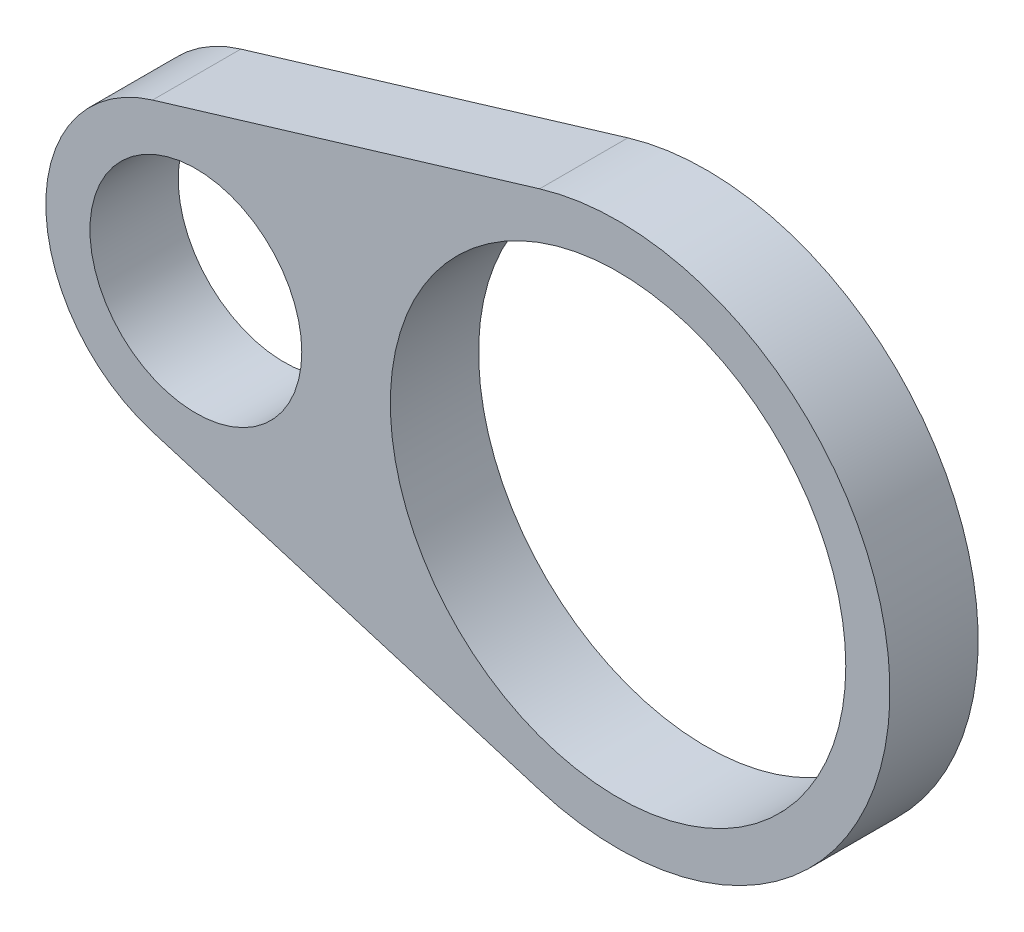
ISO-10303-21;
HEADER;
FILE_DESCRIPTION(('STEP AP214'),'2;1');
FILE_NAME('part.step','',(''),(''),'','','');
FILE_SCHEMA(('AUTOMOTIVE_DESIGN { 1 0 10303 214 1 1 1 1 }'));
ENDSEC;
DATA;
#1=APPLICATION_CONTEXT('core data for automotive mechanical design processes');
#2=APPLICATION_PROTOCOL_DEFINITION('international standard','automotive_design',2000,#1);
#3=PRODUCT_CONTEXT('',#1,'mechanical');
#4=PRODUCT('Part','Part','',(#3));
#5=PRODUCT_RELATED_PRODUCT_CATEGORY('part','',(#4));
#6=PRODUCT_DEFINITION_FORMATION('','',#4);
#7=PRODUCT_DEFINITION_CONTEXT('part definition',#1,'design');
#8=PRODUCT_DEFINITION('design','',#6,#7);
#9=PRODUCT_DEFINITION_SHAPE('','',#8);
#10=(LENGTH_UNIT() NAMED_UNIT(*) SI_UNIT(.MILLI.,.METRE.));
#11=(NAMED_UNIT(*) PLANE_ANGLE_UNIT() SI_UNIT($,.RADIAN.));
#12=(NAMED_UNIT(*) SI_UNIT($,.STERADIAN.) SOLID_ANGLE_UNIT());
#13=UNCERTAINTY_MEASURE_WITH_UNIT(LENGTH_MEASURE(1.E-05),#10,'distance_accuracy_value','');
#14=(GEOMETRIC_REPRESENTATION_CONTEXT(3) GLOBAL_UNCERTAINTY_ASSIGNED_CONTEXT((#13)) GLOBAL_UNIT_ASSIGNED_CONTEXT((#10,
#11,#12)) REPRESENTATION_CONTEXT('',''));
#15=CARTESIAN_POINT('',(0.,0.,0.));
#16=DIRECTION('',(0.,0.,1.));
#17=DIRECTION('',(1.,0.,0.));
#18=AXIS2_PLACEMENT_3D('',#15,#16,#17);
#19=CARTESIAN_POINT('',(-6.89567217227681,-22.8836121556997,10.));
#20=DIRECTION('',(0.288521848212419,0.957473311953963,0.));
#21=DIRECTION('',(-0.957473311953963,0.288521848212419,0.));
#22=AXIS2_PLACEMENT_3D('',#19,#20,#21);
#23=PLANE('',#22);
#24=DIRECTION('',(0.957473311953963,-0.288521848212419,0.));
#25=VECTOR('',#24,1.);
#26=CARTESIAN_POINT('',(-6.89567217227681,-22.8836121556997,0.));
#27=LINE('',#26,#25);
#28=CARTESIAN_POINT('',(-28.8198714196111,-16.2770463032174,0.));
#29=VERTEX_POINT('',#28);
#30=CARTESIAN_POINT('',(15.0285270750575,-29.490178008182,0.));
#31=VERTEX_POINT('',#30);
#32=EDGE_CURVE('E105',#29,#31,#27,.T.);
#33=ORIENTED_EDGE('',*,*,#32,.T.);
#34=DIRECTION('',(0.,0.,-1.));
#35=VECTOR('',#34,1.);
#36=CARTESIAN_POINT('',(15.0285270750575,-29.490178008182,10.));
#37=LINE('',#36,#35);
#38=CARTESIAN_POINT('',(15.0285270750575,-29.490178008182,10.));
#39=VERTEX_POINT('',#38);
#40=EDGE_CURVE('E11',#39,#31,#37,.T.);
#41=ORIENTED_EDGE('',*,*,#40,.F.);
#42=DIRECTION('',(0.957473311953963,-0.288521848212419,0.));
#43=VECTOR('',#42,1.);
#44=CARTESIAN_POINT('',(-6.89567217227681,-22.8836121556997,10.));
#45=LINE('',#44,#43);
#46=CARTESIAN_POINT('',(-28.8198714196111,-16.2770463032174,10.));
#47=VERTEX_POINT('',#46);
#48=EDGE_CURVE('E84',#47,#39,#45,.T.);
#49=ORIENTED_EDGE('',*,*,#48,.F.);
#50=DIRECTION('',(0.,0.,-1.));
#51=VECTOR('',#50,1.);
#52=CARTESIAN_POINT('',(-28.8198714196111,-16.2770463032174,10.));
#53=LINE('',#52,#51);
#54=EDGE_CURVE('E95',#47,#29,#53,.T.);
#55=ORIENTED_EDGE('',*,*,#54,.T.);
#56=EDGE_LOOP('',(#33,#41,#49,#55));
#57=FACE_BOUND('',#56,.T.);
#58=ADVANCED_FACE('F36',(#57),#23,.F.);
#59=CARTESIAN_POINT('',(23.915,0.,10.));
#60=DIRECTION('',(0.,0.,-1.));
#61=DIRECTION('',(-1.,0.,0.));
#62=AXIS2_PLACEMENT_3D('',#59,#60,#61);
#63=CYLINDRICAL_SURFACE('',#62,30.8);
#64=CARTESIAN_POINT('',(23.915,0.,0.));
#65=DIRECTION('',(0.,0.,1.));
#66=DIRECTION('',(1.,0.,0.));
#67=AXIS2_PLACEMENT_3D('',#64,#65,#66);
#68=CIRCLE('',#67,30.8);
#69=CARTESIAN_POINT('',(15.0285270750575,29.4901780081821,0.));
#70=VERTEX_POINT('',#69);
#71=EDGE_CURVE('E89',#31,#70,#68,.T.);
#72=ORIENTED_EDGE('',*,*,#71,.T.);
#73=DIRECTION('',(0.,0.,-1.));
#74=VECTOR('',#73,1.);
#75=CARTESIAN_POINT('',(15.0285270750575,29.4901780081821,10.));
#76=LINE('',#75,#74);
#77=CARTESIAN_POINT('',(15.0285270750575,29.4901780081821,10.));
#78=VERTEX_POINT('',#77);
#79=EDGE_CURVE('E45',#78,#70,#76,.T.);
#80=ORIENTED_EDGE('',*,*,#79,.F.);
#81=CARTESIAN_POINT('',(23.915,0.,10.));
#82=DIRECTION('',(0.,0.,1.));
#83=DIRECTION('',(1.,0.,0.));
#84=AXIS2_PLACEMENT_3D('',#81,#82,#83);
#85=CIRCLE('',#84,30.8);
#86=EDGE_CURVE('E79',#39,#78,#85,.T.);
#87=ORIENTED_EDGE('',*,*,#86,.F.);
#88=ORIENTED_EDGE('',*,*,#40,.T.);
#89=EDGE_LOOP('',(#72,#80,#87,#88));
#90=FACE_BOUND('',#89,.T.);
#91=ADVANCED_FACE('F88',(#90),#63,.T.);
#92=CARTESIAN_POINT('',(-6.89567217227682,22.8836121556997,10.));
#93=DIRECTION('',(-0.288521848212419,0.957473311953962,0.));
#94=DIRECTION('',(-0.957473311953962,-0.288521848212419,0.));
#95=AXIS2_PLACEMENT_3D('',#92,#93,#94);
#96=PLANE('',#95);
#97=DIRECTION('',(0.957473311953962,0.288521848212419,0.));
#98=VECTOR('',#97,1.);
#99=CARTESIAN_POINT('',(-6.89567217227682,22.8836121556997,0.));
#100=LINE('',#99,#98);
#101=CARTESIAN_POINT('',(-28.8198714196111,16.2770463032174,0.));
#102=VERTEX_POINT('',#101);
#103=EDGE_CURVE('E109',#102,#70,#100,.T.);
#104=ORIENTED_EDGE('',*,*,#103,.F.);
#105=DIRECTION('',(0.,0.,-1.));
#106=VECTOR('',#105,1.);
#107=CARTESIAN_POINT('',(-28.8198714196111,16.2770463032174,10.));
#108=LINE('',#107,#106);
#109=CARTESIAN_POINT('',(-28.8198714196111,16.2770463032174,10.));
#110=VERTEX_POINT('',#109);
#111=EDGE_CURVE('E69',#110,#102,#108,.T.);
#112=ORIENTED_EDGE('',*,*,#111,.F.);
#113=DIRECTION('',(0.957473311953962,0.288521848212419,0.));
#114=VECTOR('',#113,1.);
#115=CARTESIAN_POINT('',(-6.89567217227682,22.8836121556997,10.));
#116=LINE('',#115,#114);
#117=EDGE_CURVE('E82',#110,#78,#116,.T.);
#118=ORIENTED_EDGE('',*,*,#117,.T.);
#119=ORIENTED_EDGE('',*,*,#79,.T.);
#120=EDGE_LOOP('',(#104,#112,#118,#119));
#121=FACE_BOUND('',#120,.T.);
#122=ADVANCED_FACE('F93',(#121),#96,.T.);
#123=CARTESIAN_POINT('',(-23.915,0.,10.));
#124=DIRECTION('',(0.,0.,-1.));
#125=DIRECTION('',(-1.,0.,0.));
#126=AXIS2_PLACEMENT_3D('',#123,#124,#125);
#127=CYLINDRICAL_SURFACE('',#126,12.);
#128=CARTESIAN_POINT('',(-23.915,0.,10.));
#129=DIRECTION('',(0.,0.,1.));
#130=DIRECTION('',(1.,0.,0.));
#131=AXIS2_PLACEMENT_3D('',#128,#129,#130);
#132=CIRCLE('',#131,12.);
#133=CARTESIAN_POINT('',(-11.915,0.,10.));
#134=VERTEX_POINT('',#133);
#135=EDGE_CURVE('E147',#134,#134,#132,.T.);
#136=ORIENTED_EDGE('',*,*,#135,.T.);
#137=EDGE_LOOP('',(#136));
#138=FACE_BOUND('',#137,.T.);
#139=CARTESIAN_POINT('',(-23.915,0.,0.));
#140=DIRECTION('',(0.,0.,1.));
#141=DIRECTION('',(1.,0.,0.));
#142=AXIS2_PLACEMENT_3D('',#139,#140,#141);
#143=CIRCLE('',#142,12.);
#144=CARTESIAN_POINT('',(-11.915,0.,0.));
#145=VERTEX_POINT('',#144);
#146=EDGE_CURVE('E102',#145,#145,#143,.T.);
#147=ORIENTED_EDGE('',*,*,#146,.F.);
#148=EDGE_LOOP('',(#147));
#149=FACE_BOUND('',#148,.T.);
#150=ADVANCED_FACE('F136',(#138,#149),#127,.F.);
#151=CARTESIAN_POINT('',(23.915,0.,10.));
#152=DIRECTION('',(0.,0.,-1.));
#153=DIRECTION('',(-1.,0.,0.));
#154=AXIS2_PLACEMENT_3D('',#151,#152,#153);
#155=CYLINDRICAL_SURFACE('',#154,25.8);
#156=CARTESIAN_POINT('',(23.915,0.,10.));
#157=DIRECTION('',(0.,0.,1.));
#158=DIRECTION('',(1.,0.,0.));
#159=AXIS2_PLACEMENT_3D('',#156,#157,#158);
#160=CIRCLE('',#159,25.8);
#161=CARTESIAN_POINT('',(49.715,0.,10.));
#162=VERTEX_POINT('',#161);
#163=EDGE_CURVE('E112',#162,#162,#160,.T.);
#164=ORIENTED_EDGE('',*,*,#163,.T.);
#165=EDGE_LOOP('',(#164));
#166=FACE_BOUND('',#165,.T.);
#167=CARTESIAN_POINT('',(23.915,0.,0.));
#168=DIRECTION('',(0.,0.,1.));
#169=DIRECTION('',(1.,0.,0.));
#170=AXIS2_PLACEMENT_3D('',#167,#168,#169);
#171=CIRCLE('',#170,25.8);
#172=CARTESIAN_POINT('',(49.715,0.,0.));
#173=VERTEX_POINT('',#172);
#174=EDGE_CURVE('E99',#173,#173,#171,.T.);
#175=ORIENTED_EDGE('',*,*,#174,.F.);
#176=EDGE_LOOP('',(#175));
#177=FACE_BOUND('',#176,.T.);
#178=ADVANCED_FACE('F38',(#166,#177),#155,.F.);
#179=CARTESIAN_POINT('',(-23.915,0.,10.));
#180=DIRECTION('',(0.,0.,-1.));
#181=DIRECTION('',(-1.,0.,0.));
#182=AXIS2_PLACEMENT_3D('',#179,#180,#181);
#183=CYLINDRICAL_SURFACE('',#182,17.);
#184=CARTESIAN_POINT('',(-23.915,0.,0.));
#185=DIRECTION('',(0.,0.,1.));
#186=DIRECTION('',(1.,0.,0.));
#187=AXIS2_PLACEMENT_3D('',#184,#185,#186);
#188=CIRCLE('',#187,17.);
#189=EDGE_CURVE('E72',#102,#29,#188,.T.);
#190=ORIENTED_EDGE('',*,*,#189,.T.);
#191=ORIENTED_EDGE('',*,*,#54,.F.);
#192=CARTESIAN_POINT('',(-23.915,0.,10.));
#193=DIRECTION('',(0.,0.,1.));
#194=DIRECTION('',(1.,0.,0.));
#195=AXIS2_PLACEMENT_3D('',#192,#193,#194);
#196=CIRCLE('',#195,17.);
#197=EDGE_CURVE('E53',#110,#47,#196,.T.);
#198=ORIENTED_EDGE('',*,*,#197,.F.);
#199=ORIENTED_EDGE('',*,*,#111,.T.);
#200=EDGE_LOOP('',(#190,#191,#198,#199));
#201=FACE_BOUND('',#200,.T.);
#202=ADVANCED_FACE('F124',(#201),#183,.T.);
#203=CARTESIAN_POINT('',(0.,0.,10.));
#204=DIRECTION('',(0.,0.,1.));
#205=DIRECTION('',(1.,0.,0.));
#206=AXIS2_PLACEMENT_3D('',#203,#204,#205);
#207=PLANE('',#206);
#208=ORIENTED_EDGE('',*,*,#163,.F.);
#209=EDGE_LOOP('',(#208));
#210=FACE_BOUND('',#209,.T.);
#211=ORIENTED_EDGE('',*,*,#135,.F.);
#212=EDGE_LOOP('',(#211));
#213=FACE_BOUND('',#212,.T.);
#214=ORIENTED_EDGE('',*,*,#48,.T.);
#215=ORIENTED_EDGE('',*,*,#86,.T.);
#216=ORIENTED_EDGE('',*,*,#117,.F.);
#217=ORIENTED_EDGE('',*,*,#197,.T.);
#218=EDGE_LOOP('',(#214,#215,#216,#217));
#219=FACE_BOUND('',#218,.T.);
#220=ADVANCED_FACE('F80',(#210,#213,#219),#207,.T.);
#221=CARTESIAN_POINT('',(0.,0.,0.));
#222=DIRECTION('',(0.,0.,1.));
#223=DIRECTION('',(1.,0.,0.));
#224=AXIS2_PLACEMENT_3D('',#221,#222,#223);
#225=PLANE('',#224);
#226=ORIENTED_EDGE('',*,*,#174,.T.);
#227=EDGE_LOOP('',(#226));
#228=FACE_BOUND('',#227,.T.);
#229=ORIENTED_EDGE('',*,*,#146,.T.);
#230=EDGE_LOOP('',(#229));
#231=FACE_BOUND('',#230,.T.);
#232=ORIENTED_EDGE('',*,*,#32,.F.);
#233=ORIENTED_EDGE('',*,*,#189,.F.);
#234=ORIENTED_EDGE('',*,*,#103,.T.);
#235=ORIENTED_EDGE('',*,*,#71,.F.);
#236=EDGE_LOOP('',(#232,#233,#234,#235));
#237=FACE_BOUND('',#236,.T.);
#238=ADVANCED_FACE('F117',(#228,#231,#237),#225,.F.);
#239=CLOSED_SHELL('',(#58,#91,#122,#150,#178,#202,#220,#238));
#240=MANIFOLD_SOLID_BREP('B2',#239);
#241=ADVANCED_BREP_SHAPE_REPRESENTATION('',(#18,#240),#14);
#242=SHAPE_DEFINITION_REPRESENTATION(#9,#241);
ENDSEC;
END-ISO-10303-21;
